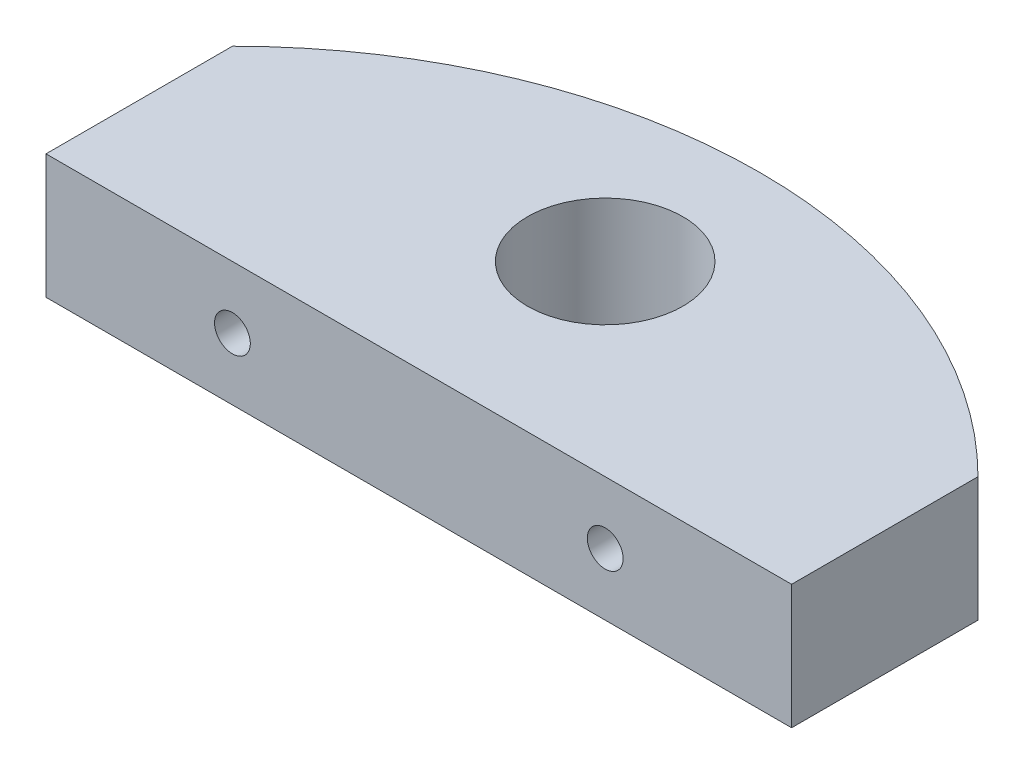
ISO-10303-21;
HEADER;
FILE_DESCRIPTION(('STEP AP214'),'2;1');
FILE_NAME('part.step','',(''),(''),'','','');
FILE_SCHEMA(('AUTOMOTIVE_DESIGN { 1 0 10303 214 1 1 1 1 }'));
ENDSEC;
DATA;
#1=APPLICATION_CONTEXT('core data for automotive mechanical design processes');
#2=APPLICATION_PROTOCOL_DEFINITION('international standard','automotive_design',2000,#1);
#3=PRODUCT_CONTEXT('',#1,'mechanical');
#4=PRODUCT('Part','Part','',(#3));
#5=PRODUCT_RELATED_PRODUCT_CATEGORY('part','',(#4));
#6=PRODUCT_DEFINITION_FORMATION('','',#4);
#7=PRODUCT_DEFINITION_CONTEXT('part definition',#1,'design');
#8=PRODUCT_DEFINITION('design','',#6,#7);
#9=PRODUCT_DEFINITION_SHAPE('','',#8);
#10=(LENGTH_UNIT() NAMED_UNIT(*) SI_UNIT(.MILLI.,.METRE.));
#11=(NAMED_UNIT(*) PLANE_ANGLE_UNIT() SI_UNIT($,.RADIAN.));
#12=(NAMED_UNIT(*) SI_UNIT($,.STERADIAN.) SOLID_ANGLE_UNIT());
#13=UNCERTAINTY_MEASURE_WITH_UNIT(LENGTH_MEASURE(1.E-05),#10,'distance_accuracy_value','');
#14=(GEOMETRIC_REPRESENTATION_CONTEXT(3) GLOBAL_UNCERTAINTY_ASSIGNED_CONTEXT((#13)) GLOBAL_UNIT_ASSIGNED_CONTEXT((#10,
#11,#12)) REPRESENTATION_CONTEXT('',''));
#15=CARTESIAN_POINT('',(0.,0.,0.));
#16=DIRECTION('',(0.,0.,1.));
#17=DIRECTION('',(1.,0.,0.));
#18=AXIS2_PLACEMENT_3D('',#15,#16,#17);
#19=CARTESIAN_POINT('',(0.,12.7,-19.05));
#20=DIRECTION('',(-1.,0.,0.));
#21=DIRECTION('',(0.,0.,1.));
#22=AXIS2_PLACEMENT_3D('',#19,#20,#21);
#23=PLANE('',#22);
#24=DIRECTION('',(0.,0.,-1.));
#25=VECTOR('',#24,1.);
#26=CARTESIAN_POINT('',(0.,0.,-19.05));
#27=LINE('',#26,#25);
#28=CARTESIAN_POINT('',(0.,0.,0.));
#29=VERTEX_POINT('',#28);
#30=CARTESIAN_POINT('',(0.,0.,-19.05));
#31=VERTEX_POINT('',#30);
#32=EDGE_CURVE('E122',#29,#31,#27,.T.);
#33=ORIENTED_EDGE('',*,*,#32,.T.);
#34=DIRECTION('',(0.,-1.,0.));
#35=VECTOR('',#34,1.);
#36=CARTESIAN_POINT('',(0.,12.7,-19.05));
#37=LINE('',#36,#35);
#38=CARTESIAN_POINT('',(0.,12.7,-19.05));
#39=VERTEX_POINT('',#38);
#40=EDGE_CURVE('E116',#39,#31,#37,.T.);
#41=ORIENTED_EDGE('',*,*,#40,.F.);
#42=DIRECTION('',(0.,0.,-1.));
#43=VECTOR('',#42,1.);
#44=CARTESIAN_POINT('',(0.,12.7,-19.05));
#45=LINE('',#44,#43);
#46=CARTESIAN_POINT('',(0.,12.7,0.));
#47=VERTEX_POINT('',#46);
#48=EDGE_CURVE('E134',#47,#39,#45,.T.);
#49=ORIENTED_EDGE('',*,*,#48,.F.);
#50=DIRECTION('',(0.,-1.,0.));
#51=VECTOR('',#50,1.);
#52=CARTESIAN_POINT('',(0.,12.7,0.));
#53=LINE('',#52,#51);
#54=EDGE_CURVE('E138',#47,#29,#53,.T.);
#55=ORIENTED_EDGE('',*,*,#54,.T.);
#56=EDGE_LOOP('',(#33,#41,#49,#55));
#57=FACE_BOUND('',#56,.T.);
#58=ADVANCED_FACE('F39',(#57),#23,.F.);
#59=CARTESIAN_POINT('',(-38.1,12.7,19.05));
#60=DIRECTION('',(0.,-1.,0.));
#61=DIRECTION('',(0.,0.,-1.));
#62=AXIS2_PLACEMENT_3D('',#59,#60,#61);
#63=CYLINDRICAL_SURFACE('',#62,53.881536726415);
#64=CARTESIAN_POINT('',(-18.1584124331521,7.74681445755214,-31.0055000505812));
#65=CARTESIAN_POINT('',(-18.2468101428194,7.8530182781852,-31.0407282210027));
#66=CARTESIAN_POINT('',(-18.3438007600855,7.95059417649513,-31.0790870041715));
#67=CARTESIAN_POINT('',(-18.551147819831,8.1272988540281,-31.160301748705));
#68=CARTESIAN_POINT('',(-18.6614583333254,8.2064884185609,-31.2031421919952));
#69=CARTESIAN_POINT('',(-18.8956353086742,8.34799004290924,-31.2931092590039));
#70=CARTESIAN_POINT('',(-19.0198035879849,8.40974164174405,-31.3403245214769));
#71=CARTESIAN_POINT('',(-19.2758966233532,8.51268398929126,-31.4365512109122));
#72=CARTESIAN_POINT('',(-19.4078309886236,8.5538486409388,-31.4855648335587));
#73=CARTESIAN_POINT('',(-19.6911368648424,8.61828263299748,-31.5894995456633));
#74=CARTESIAN_POINT('',(-19.8430524348349,8.63909210386521,-31.6444786023523));
#75=CARTESIAN_POINT('',(-20.1485505191966,8.65373579373748,-31.7534621814996));
#76=CARTESIAN_POINT('',(-20.3021331526699,8.64756807252032,-31.8074666335832));
#77=CARTESIAN_POINT('',(-20.6084242192954,8.60733925100723,-31.9136276559056));
#78=CARTESIAN_POINT('',(-20.7611002217435,8.57294538810239,-31.9657543960639));
#79=CARTESIAN_POINT('',(-21.0585297040507,8.47553444910498,-32.0658771074707));
#80=CARTESIAN_POINT('',(-21.2032859656408,8.41252749634232,-32.113874532536));
#81=CARTESIAN_POINT('',(-21.4693784183726,8.26394213452964,-32.2009577119504));
#82=CARTESIAN_POINT('',(-21.5916460822328,8.18026642819156,-32.2404330607632));
#83=CARTESIAN_POINT('',(-21.8193057229685,7.9902745819903,-32.3131509901794));
#84=CARTESIAN_POINT('',(-21.9247100236413,7.88397510926102,-32.3463981254453));
#85=CARTESIAN_POINT('',(-22.1040708428208,7.66349468683299,-32.4024849497545));
#86=CARTESIAN_POINT('',(-22.1801325689794,7.55120636922265,-32.4260381682964));
#87=CARTESIAN_POINT('',(-22.3113298442171,7.31391168410857,-32.4664307027358));
#88=CARTESIAN_POINT('',(-22.3664772436418,7.18891256979053,-32.4832738209425));
#89=CARTESIAN_POINT('',(-22.4497251689631,6.94091401200228,-32.5086136450302));
#90=CARTESIAN_POINT('',(-22.4796716104358,6.81858994246153,-32.51768115714));
#91=CARTESIAN_POINT('',(-22.5185409131508,6.570354936769,-32.5294392986823));
#92=CARTESIAN_POINT('',(-22.5274701117911,6.44444509344029,-32.5321318503788));
#93=CARTESIAN_POINT('',(-22.5240115640705,6.19819371248445,-32.5310874045544));
#94=CARTESIAN_POINT('',(-22.5124922774914,6.07783774518756,-32.5276123502218));
#95=CARTESIAN_POINT('',(-22.470262935554,5.84087475350937,-32.5148310373235));
#96=CARTESIAN_POINT('',(-22.4395541834338,5.7242674751041,-32.5055251747527));
#97=CARTESIAN_POINT('',(-22.3601303194513,5.49803258258167,-32.4813323129541));
#98=CARTESIAN_POINT('',(-22.3114204717378,5.38840293893636,-32.4664469453503));
#99=CARTESIAN_POINT('',(-22.197764280179,5.17883960308088,-32.4314764751309));
#100=CARTESIAN_POINT('',(-22.1328160667298,5.078907029183,-32.4113907737655));
#101=CARTESIAN_POINT('',(-21.986177662135,4.88744013314076,-32.3656671309838));
#102=CARTESIAN_POINT('',(-21.9039524195127,4.79635935142039,-32.3398497165805));
#103=CARTESIAN_POINT('',(-21.7270955141696,4.62881182555705,-32.2837763940087));
#104=CARTESIAN_POINT('',(-21.6324606015299,4.55234892256982,-32.2535193229085));
#105=CARTESIAN_POINT('',(-21.4265493305051,4.41036267404742,-32.186984030513));
#106=CARTESIAN_POINT('',(-21.314570483198,4.34598815387417,-32.1504319020032));
#107=CARTESIAN_POINT('',(-21.0828568700066,4.23601926234653,-32.0738862363049));
#108=CARTESIAN_POINT('',(-20.9631191393834,4.19043211937268,-32.0338913816799));
#109=CARTESIAN_POINT('',(-20.7076615825623,4.11490143391322,-31.9475131515932));
#110=CARTESIAN_POINT('',(-20.5714856173933,4.08678593948899,-31.9008806698949));
#111=CARTESIAN_POINT('',(-20.2970760346451,4.0529536325612,-31.8056489059828));
#112=CARTESIAN_POINT('',(-20.1588417908266,4.04724378286514,-31.7570490171147));
#113=CARTESIAN_POINT('',(-19.8714300211235,4.0582052128012,-31.6546789837273));
#114=CARTESIAN_POINT('',(-19.7223553077077,4.0768820705443,-31.6008290369104));
#115=CARTESIAN_POINT('',(-19.4292741467786,4.13947583978729,-31.4935296991155));
#116=CARTESIAN_POINT('',(-19.2852732736896,4.18341964649217,-31.4400807965382));
#117=CARTESIAN_POINT('',(-19.0007016890525,4.29807103793954,-31.3331403353802));
#118=CARTESIAN_POINT('',(-18.8605032913816,4.36978615539797,-31.2797339225919));
#119=CARTESIAN_POINT('',(-18.5948804357161,4.53873101115611,-31.177387706218));
#120=CARTESIAN_POINT('',(-18.4694135239852,4.63588468854578,-31.1284351639092));
#121=CARTESIAN_POINT('',(-18.3195553918428,4.77751585854815,-31.0694115411565));
#122=CARTESIAN_POINT('',(-18.2859354038501,4.81121062813372,-31.0561282455329));
#123=CARTESIAN_POINT('',(-18.2206701405506,4.88065842332409,-31.0302702156001));
#124=CARTESIAN_POINT('',(-18.1890231951075,4.91640965749715,-31.0176948829155));
#125=CARTESIAN_POINT('',(-18.1584124331521,4.95318554244778,-31.0055000505812));
#126=B_SPLINE_CURVE_WITH_KNOTS('',3,(#64,#65,#66,#67,#68,#69,#70,#71,#72,#73,#74,#75,#76,#77,
#78,#79,#80,#81,#82,#83,#84,#85,#86,#87,#88,#89,#90,#91,#92,#93,#94,#95,#96,#97,#98,#99,#100,
#101,#102,#103,#104,#105,#106,#107,#108,#109,#110,#111,#112,#113,#114,#115,#116,#117,#118,#119,
#120,#121,#122,#123,#124,#125),.UNSPECIFIED.,.F.,.F.,(4,2,2,2,2,2,2,2,2,2,2,2,2,2,2,2,2,2,2,2,2,
2,2,2,2,2,2,2,2,2,4),(0.,0.426780166719207,0.852128640885151,1.2898996178139,1.72822413779125,
2.21465523498489,2.70112131727564,3.1934062358565,3.68551711924115,4.14296149250371,
4.60007002171777,5.01082024065992,5.42133737390616,5.79821756705332,6.17498410371899,
6.5361297546899,6.8972508813912,7.25826648712612,7.61932367754301,7.99387676585792,
8.36852814101684,8.76955010761256,9.17072622234859,9.6088603958494,10.0471307137219,
10.5238155388549,11.0010087092195,11.4974393640849,11.9924023201995,12.1405900059587,
12.2886505016412),.UNSPECIFIED.);
#127=CARTESIAN_POINT('',(-18.5238970655028,8.10149226156252,-31.1495636823466));
#128=VERTEX_POINT('',#127);
#129=CARTESIAN_POINT('',(-18.5238970655028,4.59850773843748,-31.1495636823466));
#130=VERTEX_POINT('',#129);
#131=EDGE_CURVE('E51',#128,#130,#126,.T.);
#132=ORIENTED_EDGE('',*,*,#131,.T.);
#133=CARTESIAN_POINT('',(-18.5238970655028,4.59850773843747,-31.1495636823466));
#134=CARTESIAN_POINT('',(-18.4732379075444,4.61372713560305,-31.1298087821835));
#135=CARTESIAN_POINT('',(-18.4232067955288,4.63115013320763,-31.1102094956222));
#136=CARTESIAN_POINT('',(-18.3246876389395,4.67034309147692,-31.0714506743408));
#137=CARTESIAN_POINT('',(-18.2761999320344,4.69211399590691,-31.0522912361035));
#138=CARTESIAN_POINT('',(-18.1333644818645,4.76392260786246,-30.9956185519237));
#139=CARTESIAN_POINT('',(-18.0418069716962,4.82040756165538,-30.9589744337642));
#140=CARTESIAN_POINT('',(-17.8690140161999,4.94948440394999,-30.8893224735209));
#141=CARTESIAN_POINT('',(-17.7877973865382,5.02210501129291,-30.8563212739888));
#142=CARTESIAN_POINT('',(-17.6387832734637,5.18172455204671,-30.7954119208549));
#143=CARTESIAN_POINT('',(-17.5709694718538,5.26870576124959,-30.7674975771805));
#144=CARTESIAN_POINT('',(-17.4546207272433,5.44986154150547,-30.7193890442444));
#145=CARTESIAN_POINT('',(-17.4052590674208,5.54341671761625,-30.6988658994758));
#146=CARTESIAN_POINT('',(-17.32313280881,5.73873405639738,-30.6646234806124));
#147=CARTESIAN_POINT('',(-17.2903640015252,5.84049413043593,-30.6509024812869));
#148=CARTESIAN_POINT('',(-17.2447852308703,6.04100710852789,-30.6317932661279));
#149=CARTESIAN_POINT('',(-17.2306583630499,6.139409623076,-30.6258554720863));
#150=CARTESIAN_POINT('',(-17.2185602038401,6.33735800000311,-30.6207712938803));
#151=CARTESIAN_POINT('',(-17.2205828085725,6.43690341620524,-30.6216223437946));
#152=CARTESIAN_POINT('',(-17.2402638438794,6.62999798462148,-30.6298903715696));
#153=CARTESIAN_POINT('',(-17.2572776054618,6.72362562035955,-30.6370366317259));
#154=CARTESIAN_POINT('',(-17.3053710897644,6.90652679015385,-30.6571834031895));
#155=CARTESIAN_POINT('',(-17.3364516558497,6.99580006279179,-30.670184265505));
#156=CARTESIAN_POINT('',(-17.4120779266878,7.16901591301735,-30.701699200643));
#157=CARTESIAN_POINT('',(-17.4568182318245,7.25285868870579,-30.720292889632));
#158=CARTESIAN_POINT('',(-17.5580419286705,7.41181683991552,-30.7621566504324));
#159=CARTESIAN_POINT('',(-17.6145276724332,7.48693046269853,-30.7854276588575));
#160=CARTESIAN_POINT('',(-17.7411708312133,7.63110132504985,-30.8373031984609));
#161=CARTESIAN_POINT('',(-17.811940308928,7.69953536173997,-30.8661421620356));
#162=CARTESIAN_POINT('',(-17.9626460847169,7.82367014264865,-30.9271305582441));
#163=CARTESIAN_POINT('',(-18.0425848462269,7.87936745290756,-30.9592808802752));
#164=CARTESIAN_POINT('',(-18.1889905575552,7.96508578602846,-31.0177170959326));
#165=CARTESIAN_POINT('',(-18.2539551139383,7.99805397346155,-31.0435081569129));
#166=CARTESIAN_POINT('',(-18.3868694702217,8.05587579218994,-31.0959633111529));
#167=CARTESIAN_POINT('',(-18.4548121748871,8.08074763473312,-31.1226252945672));
#168=CARTESIAN_POINT('',(-18.5238970655028,8.10149226156252,-31.1495636823466));
#169=B_SPLINE_CURVE_WITH_KNOTS('',3,(#133,#134,#135,#136,#137,#138,#139,#140,#141,#142,#143,
#144,#145,#146,#147,#148,#149,#150,#151,#152,#153,#154,#155,#156,#157,#158,#159,#160,#161,#162,
#163,#164,#165,#166,#167,#168),.UNSPECIFIED.,.F.,.F.,(4,2,2,2,2,2,2,2,2,2,2,2,2,2,2,2,2,4),(0.,
0.169296833450099,0.338630454825562,0.677834615414036,1.01764741050356,1.35704389331256,
1.67858048056664,2.00003547460028,2.29728906711867,2.5944303145582,2.87938500745905,
3.16435678687895,3.45359442198567,3.74289003352573,4.04933938722378,4.35587126583625,
4.58724724289448,4.81809912685974),.UNSPECIFIED.);
#170=EDGE_CURVE('E11',#130,#128,#169,.T.);
#171=ORIENTED_EDGE('',*,*,#170,.T.);
#172=EDGE_LOOP('',(#132,#171));
#173=FACE_BOUND('',#172,.T.);
#174=CARTESIAN_POINT('',(-58.0415875668479,4.95318554244786,-31.0055000505812));
#175=CARTESIAN_POINT('',(-57.9531898571806,4.84698172181482,-31.0407282210027));
#176=CARTESIAN_POINT('',(-57.8561992399144,4.74940582350488,-31.0790870041715));
#177=CARTESIAN_POINT('',(-57.648852180169,4.57270114597191,-31.160301748705));
#178=CARTESIAN_POINT('',(-57.5385416666746,4.49351158143911,-31.2031421919952));
#179=CARTESIAN_POINT('',(-57.3043646913258,4.35200995709076,-31.2931092590039));
#180=CARTESIAN_POINT('',(-57.1801964120151,4.29025835825595,-31.340324521477));
#181=CARTESIAN_POINT('',(-56.9241033766468,4.18731601070875,-31.4365512109122));
#182=CARTESIAN_POINT('',(-56.7921690113764,4.14615135906121,-31.4855648335587));
#183=CARTESIAN_POINT('',(-56.5088631351576,4.08171736700253,-31.5894995456633));
#184=CARTESIAN_POINT('',(-56.3569475651651,4.06090789613479,-31.6444786023523));
#185=CARTESIAN_POINT('',(-56.0514494808034,4.04626420626252,-31.7534621814996));
#186=CARTESIAN_POINT('',(-55.8978668473301,4.05243192747968,-31.8074666335832));
#187=CARTESIAN_POINT('',(-55.5915757807046,4.09266074899277,-31.9136276559056));
#188=CARTESIAN_POINT('',(-55.4388997782565,4.12705461189761,-31.9657543960639));
#189=CARTESIAN_POINT('',(-55.1414702959494,4.22446555089501,-32.0658771074707));
#190=CARTESIAN_POINT('',(-54.9967140343592,4.28747250365767,-32.113874532536));
#191=CARTESIAN_POINT('',(-54.7306215816274,4.43605786547035,-32.2009577119504));
#192=CARTESIAN_POINT('',(-54.6083539177672,4.51973357180843,-32.2404330607632));
#193=CARTESIAN_POINT('',(-54.3806942770315,4.70972541800968,-32.3131509901794));
#194=CARTESIAN_POINT('',(-54.2752899763587,4.81602489073896,-32.3463981254453));
#195=CARTESIAN_POINT('',(-54.0959291571791,5.03650531316699,-32.4024849497545));
#196=CARTESIAN_POINT('',(-54.0198674310206,5.14879363077733,-32.4260381682964));
#197=CARTESIAN_POINT('',(-53.8886701557829,5.38608831589141,-32.4664307027358));
#198=CARTESIAN_POINT('',(-53.8335227563582,5.51108743020945,-32.4832738209425));
#199=CARTESIAN_POINT('',(-53.7502748310369,5.7590859879977,-32.5086136450302));
#200=CARTESIAN_POINT('',(-53.7203283895642,5.88141005753845,-32.51768115714));
#201=CARTESIAN_POINT('',(-53.6814590868491,6.12964506323098,-32.5294392986823));
#202=CARTESIAN_POINT('',(-53.6725298882089,6.25555490655969,-32.5321318503788));
#203=CARTESIAN_POINT('',(-53.6759884359294,6.50180628751553,-32.5310874045544));
#204=CARTESIAN_POINT('',(-53.6875077225086,6.62216225481242,-32.5276123502218));
#205=CARTESIAN_POINT('',(-53.729737064446,6.85912524649061,-32.5148310373235));
#206=CARTESIAN_POINT('',(-53.7604458165662,6.97573252489588,-32.5055251747527));
#207=CARTESIAN_POINT('',(-53.8398696805487,7.20196741741831,-32.4813323129541));
#208=CARTESIAN_POINT('',(-53.8885795282622,7.31159706106363,-32.4664469453503));
#209=CARTESIAN_POINT('',(-54.002235719821,7.52116039691911,-32.4314764751309));
#210=CARTESIAN_POINT('',(-54.0671839332702,7.62109297081699,-32.4113907737655));
#211=CARTESIAN_POINT('',(-54.213822337865,7.81255986685923,-32.3656671309838));
#212=CARTESIAN_POINT('',(-54.2960475804873,7.90364064857959,-32.3398497165805));
#213=CARTESIAN_POINT('',(-54.4729044858304,8.07118817444293,-32.2837763940087));
#214=CARTESIAN_POINT('',(-54.5675393984701,8.14765107743017,-32.2535193229085));
#215=CARTESIAN_POINT('',(-54.7734506694949,8.28963732595258,-32.186984030513));
#216=CARTESIAN_POINT('',(-54.8854295168019,8.35401184612581,-32.1504319020032));
#217=CARTESIAN_POINT('',(-55.1171431299934,8.46398073765346,-32.0738862363049));
#218=CARTESIAN_POINT('',(-55.2368808606165,8.50956788062732,-32.0338913816799));
#219=CARTESIAN_POINT('',(-55.4923384174377,8.58509856608678,-31.9475131515933));
#220=CARTESIAN_POINT('',(-55.6285143826067,8.61321406051101,-31.9008806698949));
#221=CARTESIAN_POINT('',(-55.9029239653548,8.6470463674388,-31.8056489059828));
#222=CARTESIAN_POINT('',(-56.0411582091733,8.65275621713487,-31.7570490171147));
#223=CARTESIAN_POINT('',(-56.3285699788765,8.64179478719881,-31.6546789837273));
#224=CARTESIAN_POINT('',(-56.4776446922923,8.6231179294557,-31.6008290369104));
#225=CARTESIAN_POINT('',(-56.7707258532214,8.56052416021271,-31.4935296991155));
#226=CARTESIAN_POINT('',(-56.9147267263104,8.51658035350784,-31.4400807965382));
#227=CARTESIAN_POINT('',(-57.1992983109474,8.40192896206046,-31.3331403353802));
#228=CARTESIAN_POINT('',(-57.3394967086183,8.33021384460204,-31.2797339225919));
#229=CARTESIAN_POINT('',(-57.6051195642839,8.1612689888439,-31.177387706218));
#230=CARTESIAN_POINT('',(-57.7305864760148,8.06411531145423,-31.1284351639092));
#231=CARTESIAN_POINT('',(-57.8804446081572,7.92248414145186,-31.0694115411565));
#232=CARTESIAN_POINT('',(-57.9140645961499,7.88878937186628,-31.0561282455329));
#233=CARTESIAN_POINT('',(-57.9793298594494,7.81934157667591,-31.0302702156001));
#234=CARTESIAN_POINT('',(-58.0109768048925,7.78359034250285,-31.0176948829155));
#235=CARTESIAN_POINT('',(-58.0415875668479,7.74681445755221,-31.0055000505812));
#236=B_SPLINE_CURVE_WITH_KNOTS('',3,(#174,#175,#176,#177,#178,#179,#180,#181,#182,#183,#184,
#185,#186,#187,#188,#189,#190,#191,#192,#193,#194,#195,#196,#197,#198,#199,#200,#201,#202,#203,
#204,#205,#206,#207,#208,#209,#210,#211,#212,#213,#214,#215,#216,#217,#218,#219,#220,#221,#222,
#223,#224,#225,#226,#227,#228,#229,#230,#231,#232,#233,#234,#235),.UNSPECIFIED.,.F.,.F.,(4,2,2,
2,2,2,2,2,2,2,2,2,2,2,2,2,2,2,2,2,2,2,2,2,2,2,2,2,2,2,4),(0.,0.426780166719204,
0.852128640885133,1.2898996178139,1.72822413779124,2.21465523498488,2.70112131727562,
3.19340623585648,3.68551711924113,4.1429614925037,4.60007002171775,5.01082024065991,
5.42133737390615,5.79821756705331,6.17498410371898,6.53612975468989,6.8972508813912,
7.25826648712612,7.61932367754301,7.99387676585792,8.36852814101684,8.76955010761256,
9.17072622234858,9.60886039584938,10.0471307137219,10.5238155388549,11.0010087092195,
11.4974393640849,11.9924023201995,12.1405900059587,12.2886505016412),.UNSPECIFIED.);
#237=CARTESIAN_POINT('',(-57.6761029344972,4.59850773843748,-31.1495636823466));
#238=VERTEX_POINT('',#237);
#239=CARTESIAN_POINT('',(-57.6761029344972,8.10149226156252,-31.1495636823466));
#240=VERTEX_POINT('',#239);
#241=EDGE_CURVE('E108',#238,#240,#236,.T.);
#242=ORIENTED_EDGE('',*,*,#241,.T.);
#243=CARTESIAN_POINT('',(-57.6761029344972,8.10149226156252,-31.1495636823466));
#244=CARTESIAN_POINT('',(-57.7267620924556,8.08627286439695,-31.1298087821835));
#245=CARTESIAN_POINT('',(-57.7767932044712,8.06884986679237,-31.1102094956222));
#246=CARTESIAN_POINT('',(-57.8753123610605,8.02965690852308,-31.0714506743408));
#247=CARTESIAN_POINT('',(-57.9238000679656,8.00788600409309,-31.0522912361035));
#248=CARTESIAN_POINT('',(-58.0666355181355,7.93607739213754,-30.9956185519237));
#249=CARTESIAN_POINT('',(-58.1581930283037,7.87959243834462,-30.9589744337642));
#250=CARTESIAN_POINT('',(-58.3309859838001,7.75051559605001,-30.8893224735209));
#251=CARTESIAN_POINT('',(-58.4122026134618,7.67789498870708,-30.8563212739888));
#252=CARTESIAN_POINT('',(-58.5612167265363,7.51827544795329,-30.7954119208549));
#253=CARTESIAN_POINT('',(-58.6290305281462,7.43129423875041,-30.7674975771805));
#254=CARTESIAN_POINT('',(-58.7453792727567,7.25013845849453,-30.7193890442444));
#255=CARTESIAN_POINT('',(-58.7947409325792,7.15658328238375,-30.6988658994758));
#256=CARTESIAN_POINT('',(-58.87686719119,6.96126594360262,-30.6646234806124));
#257=CARTESIAN_POINT('',(-58.9096359984748,6.85950586956407,-30.650902481287));
#258=CARTESIAN_POINT('',(-58.9552147691297,6.6589928914721,-30.631793266128));
#259=CARTESIAN_POINT('',(-58.9693416369501,6.560590376924,-30.6258554720863));
#260=CARTESIAN_POINT('',(-58.9814397961599,6.36264199999688,-30.6207712938803));
#261=CARTESIAN_POINT('',(-58.9794171914275,6.26309658379476,-30.6216223437946));
#262=CARTESIAN_POINT('',(-58.9597361561206,6.07000201537852,-30.6298903715696));
#263=CARTESIAN_POINT('',(-58.9427223945382,5.97637437964045,-30.6370366317259));
#264=CARTESIAN_POINT('',(-58.8946289102356,5.79347320984615,-30.6571834031895));
#265=CARTESIAN_POINT('',(-58.8635483441502,5.7041999372082,-30.670184265505));
#266=CARTESIAN_POINT('',(-58.7879220733122,5.53098408698265,-30.7016992006431));
#267=CARTESIAN_POINT('',(-58.7431817681755,5.44714131129421,-30.720292889632));
#268=CARTESIAN_POINT('',(-58.6419580713294,5.28818316008447,-30.7621566504324));
#269=CARTESIAN_POINT('',(-58.5854723275667,5.21306953730147,-30.7854276588575));
#270=CARTESIAN_POINT('',(-58.4588291687867,5.06889867495014,-30.8373031984609));
#271=CARTESIAN_POINT('',(-58.388059691072,5.00046463826002,-30.8661421620356));
#272=CARTESIAN_POINT('',(-58.2373539152831,4.87632985735135,-30.9271305582441));
#273=CARTESIAN_POINT('',(-58.1574151537731,4.82063254709244,-30.9592808802752));
#274=CARTESIAN_POINT('',(-58.0110094424448,4.73491421397154,-31.0177170959326));
#275=CARTESIAN_POINT('',(-57.9460448860617,4.70194602653845,-31.0435081569129));
#276=CARTESIAN_POINT('',(-57.8131305297783,4.64412420781006,-31.0959633111529));
#277=CARTESIAN_POINT('',(-57.7451878251129,4.61925236526689,-31.1226252945672));
#278=CARTESIAN_POINT('',(-57.6761029344972,4.59850773843748,-31.1495636823466));
#279=B_SPLINE_CURVE_WITH_KNOTS('',3,(#243,#244,#245,#246,#247,#248,#249,#250,#251,#252,#253,
#254,#255,#256,#257,#258,#259,#260,#261,#262,#263,#264,#265,#266,#267,#268,#269,#270,#271,#272,
#273,#274,#275,#276,#277,#278),.UNSPECIFIED.,.F.,.F.,(4,2,2,2,2,2,2,2,2,2,2,2,2,2,2,2,2,4),(0.,
0.169296833450095,0.338630454825561,0.677834615414033,1.01764741050355,1.35704389331255,
1.67858048056663,2.00003547460027,2.29728906711866,2.59443031455819,2.87938500745904,
3.16435678687894,3.45359442198566,3.74289003352572,4.04933938722378,4.35587126583624,
4.58724724289447,4.81809912685972),.UNSPECIFIED.);
#280=EDGE_CURVE('E96',#240,#238,#279,.T.);
#281=ORIENTED_EDGE('',*,*,#280,.T.);
#282=EDGE_LOOP('',(#242,#281));
#283=FACE_BOUND('',#282,.T.);
#284=CARTESIAN_POINT('',(-38.1,0.,19.05));
#285=DIRECTION('',(0.,1.,0.));
#286=DIRECTION('',(0.,0.,-1.));
#287=AXIS2_PLACEMENT_3D('',#284,#285,#286);
#288=CIRCLE('',#287,53.881536726415);
#289=CARTESIAN_POINT('',(-76.2,0.,-19.05));
#290=VERTEX_POINT('',#289);
#291=EDGE_CURVE('E111',#31,#290,#288,.T.);
#292=ORIENTED_EDGE('',*,*,#291,.T.);
#293=DIRECTION('',(0.,-1.,0.));
#294=VECTOR('',#293,1.);
#295=CARTESIAN_POINT('',(-76.2,12.7,-19.05));
#296=LINE('',#295,#294);
#297=CARTESIAN_POINT('',(-76.2,12.7,-19.05));
#298=VERTEX_POINT('',#297);
#299=EDGE_CURVE('E113',#298,#290,#296,.T.);
#300=ORIENTED_EDGE('',*,*,#299,.F.);
#301=CARTESIAN_POINT('',(-38.1,12.7,19.05));
#302=DIRECTION('',(0.,1.,0.));
#303=DIRECTION('',(0.,0.,-1.));
#304=AXIS2_PLACEMENT_3D('',#301,#302,#303);
#305=CIRCLE('',#304,53.881536726415);
#306=EDGE_CURVE('E197',#39,#298,#305,.T.);
#307=ORIENTED_EDGE('',*,*,#306,.F.);
#308=ORIENTED_EDGE('',*,*,#40,.T.);
#309=EDGE_LOOP('',(#292,#300,#307,#308));
#310=FACE_BOUND('',#309,.T.);
#311=ADVANCED_FACE('F101',(#173,#283,#310),#63,.T.);
#312=CARTESIAN_POINT('',(-76.2,12.7,0.));
#313=DIRECTION('',(1.,0.,0.));
#314=DIRECTION('',(0.,0.,-1.));
#315=AXIS2_PLACEMENT_3D('',#312,#313,#314);
#316=PLANE('',#315);
#317=DIRECTION('',(0.,0.,1.));
#318=VECTOR('',#317,1.);
#319=CARTESIAN_POINT('',(-76.2,0.,0.));
#320=LINE('',#319,#318);
#321=CARTESIAN_POINT('',(-76.2,0.,0.));
#322=VERTEX_POINT('',#321);
#323=EDGE_CURVE('E121',#290,#322,#320,.T.);
#324=ORIENTED_EDGE('',*,*,#323,.T.);
#325=DIRECTION('',(0.,-1.,0.));
#326=VECTOR('',#325,1.);
#327=CARTESIAN_POINT('',(-76.2,12.7,0.));
#328=LINE('',#327,#326);
#329=CARTESIAN_POINT('',(-76.2,12.7,0.));
#330=VERTEX_POINT('',#329);
#331=EDGE_CURVE('E128',#330,#322,#328,.T.);
#332=ORIENTED_EDGE('',*,*,#331,.F.);
#333=DIRECTION('',(0.,0.,1.));
#334=VECTOR('',#333,1.);
#335=CARTESIAN_POINT('',(-76.2,12.7,0.));
#336=LINE('',#335,#334);
#337=EDGE_CURVE('E127',#298,#330,#336,.T.);
#338=ORIENTED_EDGE('',*,*,#337,.F.);
#339=ORIENTED_EDGE('',*,*,#299,.T.);
#340=EDGE_LOOP('',(#324,#332,#338,#339));
#341=FACE_BOUND('',#340,.T.);
#342=ADVANCED_FACE('F104',(#341),#316,.F.);
#343=CARTESIAN_POINT('',(0.,12.7,0.));
#344=DIRECTION('',(0.,0.,-1.));
#345=DIRECTION('',(-1.,0.,0.));
#346=AXIS2_PLACEMENT_3D('',#343,#344,#345);
#347=PLANE('',#346);
#348=CARTESIAN_POINT('',(-19.05,6.35,0.));
#349=DIRECTION('',(0.,0.,-1.));
#350=DIRECTION('',(-1.,0.,0.));
#351=AXIS2_PLACEMENT_3D('',#348,#349,#350);
#352=CIRCLE('',#351,1.82879999999999);
#353=CARTESIAN_POINT('',(-20.8788,6.35,0.));
#354=VERTEX_POINT('',#353);
#355=EDGE_CURVE('E99',#354,#354,#352,.T.);
#356=ORIENTED_EDGE('',*,*,#355,.T.);
#357=EDGE_LOOP('',(#356));
#358=FACE_BOUND('',#357,.T.);
#359=CARTESIAN_POINT('',(-57.15,6.35,0.));
#360=DIRECTION('',(0.,0.,-1.));
#361=DIRECTION('',(-1.,0.,0.));
#362=AXIS2_PLACEMENT_3D('',#359,#360,#361);
#363=CIRCLE('',#362,1.82879999999999);
#364=CARTESIAN_POINT('',(-58.9788,6.35,0.));
#365=VERTEX_POINT('',#364);
#366=EDGE_CURVE('E203',#365,#365,#363,.T.);
#367=ORIENTED_EDGE('',*,*,#366,.T.);
#368=EDGE_LOOP('',(#367));
#369=FACE_BOUND('',#368,.T.);
#370=DIRECTION('',(1.,0.,0.));
#371=VECTOR('',#370,1.);
#372=CARTESIAN_POINT('',(0.,0.,0.));
#373=LINE('',#372,#371);
#374=EDGE_CURVE('E132',#322,#29,#373,.T.);
#375=ORIENTED_EDGE('',*,*,#374,.T.);
#376=ORIENTED_EDGE('',*,*,#54,.F.);
#377=DIRECTION('',(1.,0.,0.));
#378=VECTOR('',#377,1.);
#379=CARTESIAN_POINT('',(0.,12.7,0.));
#380=LINE('',#379,#378);
#381=EDGE_CURVE('E141',#330,#47,#380,.T.);
#382=ORIENTED_EDGE('',*,*,#381,.F.);
#383=ORIENTED_EDGE('',*,*,#331,.T.);
#384=EDGE_LOOP('',(#375,#376,#382,#383));
#385=FACE_BOUND('',#384,.T.);
#386=ADVANCED_FACE('F174',(#358,#369,#385),#347,.F.);
#387=CARTESIAN_POINT('',(-38.1,12.7,19.05));
#388=DIRECTION('',(0.,-1.,0.));
#389=DIRECTION('',(0.,0.,-1.));
#390=AXIS2_PLACEMENT_3D('',#387,#388,#389);
#391=PLANE('',#390);
#392=CARTESIAN_POINT('',(-38.1,12.7,-19.05));
#393=DIRECTION('',(0.,1.,0.));
#394=DIRECTION('',(0.,0.,1.));
#395=AXIS2_PLACEMENT_3D('',#392,#393,#394);
#396=CIRCLE('',#395,7.93749999999999);
#397=CARTESIAN_POINT('',(-38.1,12.7,-11.1125));
#398=VERTEX_POINT('',#397);
#399=EDGE_CURVE('E192',#398,#398,#396,.T.);
#400=ORIENTED_EDGE('',*,*,#399,.F.);
#401=EDGE_LOOP('',(#400));
#402=FACE_BOUND('',#401,.T.);
#403=ORIENTED_EDGE('',*,*,#48,.T.);
#404=ORIENTED_EDGE('',*,*,#306,.T.);
#405=ORIENTED_EDGE('',*,*,#337,.T.);
#406=ORIENTED_EDGE('',*,*,#381,.T.);
#407=EDGE_LOOP('',(#403,#404,#405,#406));
#408=FACE_BOUND('',#407,.T.);
#409=ADVANCED_FACE('F171',(#402,#408),#391,.F.);
#410=CARTESIAN_POINT('',(-38.1,0.,19.05));
#411=DIRECTION('',(0.,-1.,0.));
#412=DIRECTION('',(0.,0.,-1.));
#413=AXIS2_PLACEMENT_3D('',#410,#411,#412);
#414=PLANE('',#413);
#415=CARTESIAN_POINT('',(-38.1,0.,-19.05));
#416=DIRECTION('',(0.,1.,0.));
#417=DIRECTION('',(0.,0.,1.));
#418=AXIS2_PLACEMENT_3D('',#415,#416,#417);
#419=CIRCLE('',#418,7.9375);
#420=CARTESIAN_POINT('',(-38.1,0.,-11.1125));
#421=VERTEX_POINT('',#420);
#422=EDGE_CURVE('E190',#421,#421,#419,.T.);
#423=ORIENTED_EDGE('',*,*,#422,.T.);
#424=EDGE_LOOP('',(#423));
#425=FACE_BOUND('',#424,.T.);
#426=ORIENTED_EDGE('',*,*,#32,.F.);
#427=ORIENTED_EDGE('',*,*,#374,.F.);
#428=ORIENTED_EDGE('',*,*,#323,.F.);
#429=ORIENTED_EDGE('',*,*,#291,.F.);
#430=EDGE_LOOP('',(#426,#427,#428,#429));
#431=FACE_BOUND('',#430,.T.);
#432=ADVANCED_FACE('F131',(#425,#431),#414,.T.);
#433=CARTESIAN_POINT('',(-38.1,12.7,-19.05));
#434=DIRECTION('',(0.,1.,0.));
#435=DIRECTION('',(0.,0.,1.));
#436=AXIS2_PLACEMENT_3D('',#433,#434,#435);
#437=CYLINDRICAL_SURFACE('',#436,7.93749999999999);
#438=ORIENTED_EDGE('',*,*,#422,.F.);
#439=EDGE_LOOP('',(#438));
#440=FACE_BOUND('',#439,.T.);
#441=ORIENTED_EDGE('',*,*,#399,.T.);
#442=EDGE_LOOP('',(#441));
#443=FACE_BOUND('',#442,.T.);
#444=ADVANCED_FACE('F166',(#440,#443),#437,.F.);
#445=CARTESIAN_POINT('',(-57.15,6.35,-32.5882));
#446=DIRECTION('',(0.,0.,-1.));
#447=DIRECTION('',(-1.,0.,0.));
#448=AXIS2_PLACEMENT_3D('',#445,#446,#447);
#449=CYLINDRICAL_SURFACE('',#448,1.82879999999999);
#450=ORIENTED_EDGE('',*,*,#366,.F.);
#451=EDGE_LOOP('',(#450));
#452=FACE_BOUND('',#451,.T.);
#453=CARTESIAN_POINT('',(-57.15,6.35,-31.1495636823466));
#454=DIRECTION('',(0.,0.,-1.));
#455=DIRECTION('',(-1.,0.,0.));
#456=AXIS2_PLACEMENT_3D('',#453,#454,#455);
#457=CIRCLE('',#456,1.82879999999998);
#458=EDGE_CURVE('E64',#240,#238,#457,.T.);
#459=ORIENTED_EDGE('',*,*,#458,.T.);
#460=ORIENTED_EDGE('',*,*,#280,.F.);
#461=EDGE_LOOP('',(#459,#460));
#462=FACE_BOUND('',#461,.T.);
#463=ADVANCED_FACE('F160',(#452,#462),#449,.F.);
#464=CARTESIAN_POINT('',(-57.15,6.35,-32.5882));
#465=DIRECTION('',(0.,0.,-1.));
#466=DIRECTION('',(-1.,0.,0.));
#467=AXIS2_PLACEMENT_3D('',#464,#465,#466);
#468=CONICAL_SURFACE('',#467,3.5433,0.872664625997177);
#469=ORIENTED_EDGE('',*,*,#458,.F.);
#470=ORIENTED_EDGE('',*,*,#241,.F.);
#471=EDGE_LOOP('',(#469,#470));
#472=FACE_BOUND('',#471,.T.);
#473=ADVANCED_FACE('F157',(#472),#468,.F.);
#474=CARTESIAN_POINT('',(-19.05,6.35,-32.5882));
#475=DIRECTION('',(0.,0.,-1.));
#476=DIRECTION('',(-1.,0.,0.));
#477=AXIS2_PLACEMENT_3D('',#474,#475,#476);
#478=CYLINDRICAL_SURFACE('',#477,1.82879999999999);
#479=ORIENTED_EDGE('',*,*,#355,.F.);
#480=EDGE_LOOP('',(#479));
#481=FACE_BOUND('',#480,.T.);
#482=CARTESIAN_POINT('',(-19.05,6.35,-31.1495636823466));
#483=DIRECTION('',(0.,0.,-1.));
#484=DIRECTION('',(-1.,0.,0.));
#485=AXIS2_PLACEMENT_3D('',#482,#483,#484);
#486=CIRCLE('',#485,1.82879999999999);
#487=EDGE_CURVE('E57',#130,#128,#486,.T.);
#488=ORIENTED_EDGE('',*,*,#487,.T.);
#489=ORIENTED_EDGE('',*,*,#170,.F.);
#490=EDGE_LOOP('',(#488,#489));
#491=FACE_BOUND('',#490,.T.);
#492=ADVANCED_FACE('F98',(#481,#491),#478,.F.);
#493=CARTESIAN_POINT('',(-19.05,6.35,-32.5882));
#494=DIRECTION('',(0.,0.,-1.));
#495=DIRECTION('',(-1.,0.,0.));
#496=AXIS2_PLACEMENT_3D('',#493,#494,#495);
#497=CONICAL_SURFACE('',#496,3.5433,0.872664625997176);
#498=ORIENTED_EDGE('',*,*,#487,.F.);
#499=ORIENTED_EDGE('',*,*,#131,.F.);
#500=EDGE_LOOP('',(#498,#499));
#501=FACE_BOUND('',#500,.T.);
#502=ADVANCED_FACE('F94',(#501),#497,.F.);
#503=CLOSED_SHELL('',(#58,#311,#342,#386,#409,#432,#444,#463,#473,#492,#502));
#504=MANIFOLD_SOLID_BREP('B2',#503);
#505=ADVANCED_BREP_SHAPE_REPRESENTATION('',(#18,#504),#14);
#506=SHAPE_DEFINITION_REPRESENTATION(#9,#505);
ENDSEC;
END-ISO-10303-21;
